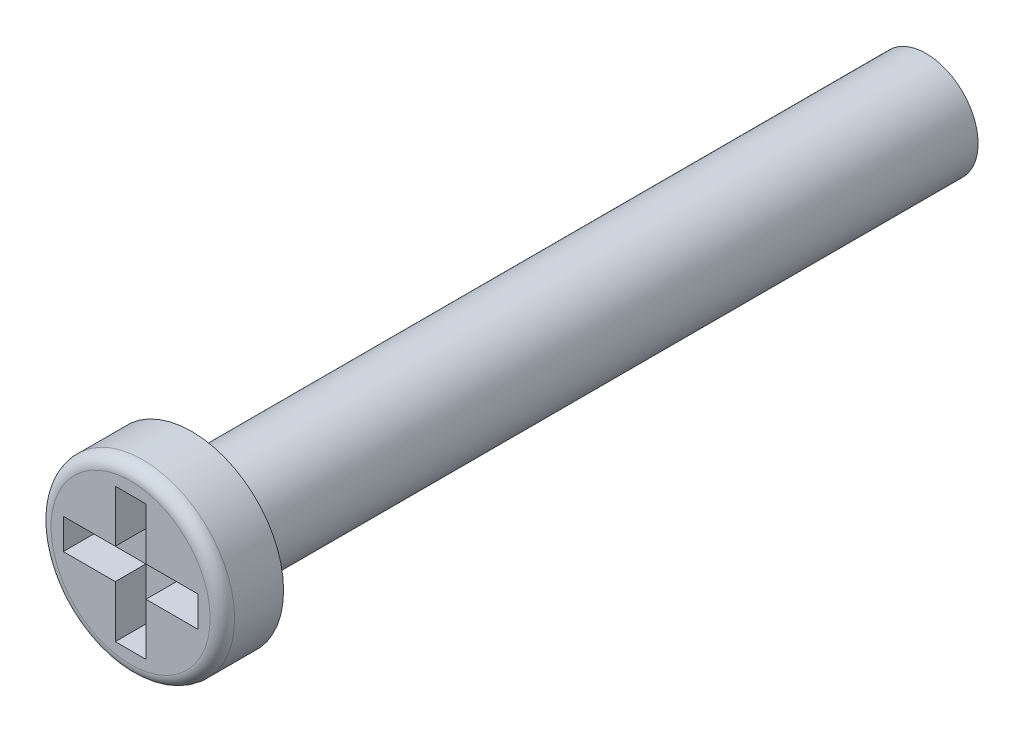
ISO-10303-21;
HEADER;
FILE_DESCRIPTION(('STEP AP214'),'2;1');
FILE_NAME('part.step','',(''),(''),'','','');
FILE_SCHEMA(('AUTOMOTIVE_DESIGN { 1 0 10303 214 1 1 1 1 }'));
ENDSEC;
DATA;
#1=APPLICATION_CONTEXT('core data for automotive mechanical design processes');
#2=APPLICATION_PROTOCOL_DEFINITION('international standard','automotive_design',2000,#1);
#3=PRODUCT_CONTEXT('',#1,'mechanical');
#4=PRODUCT('Part','Part','',(#3));
#5=PRODUCT_RELATED_PRODUCT_CATEGORY('part','',(#4));
#6=PRODUCT_DEFINITION_FORMATION('','',#4);
#7=PRODUCT_DEFINITION_CONTEXT('part definition',#1,'design');
#8=PRODUCT_DEFINITION('design','',#6,#7);
#9=PRODUCT_DEFINITION_SHAPE('','',#8);
#10=(LENGTH_UNIT() NAMED_UNIT(*) SI_UNIT(.MILLI.,.METRE.));
#11=(NAMED_UNIT(*) PLANE_ANGLE_UNIT() SI_UNIT($,.RADIAN.));
#12=(NAMED_UNIT(*) SI_UNIT($,.STERADIAN.) SOLID_ANGLE_UNIT());
#13=UNCERTAINTY_MEASURE_WITH_UNIT(LENGTH_MEASURE(1.E-05),#10,'distance_accuracy_value','');
#14=(GEOMETRIC_REPRESENTATION_CONTEXT(3) GLOBAL_UNCERTAINTY_ASSIGNED_CONTEXT((#13)) GLOBAL_UNIT_ASSIGNED_CONTEXT((#10,
#11,#12)) REPRESENTATION_CONTEXT('',''));
#15=CARTESIAN_POINT('',(0.,0.,0.));
#16=DIRECTION('',(0.,0.,1.));
#17=DIRECTION('',(1.,0.,0.));
#18=AXIS2_PLACEMENT_3D('',#15,#16,#17);
#19=CARTESIAN_POINT('',(0.,0.,1.));
#20=DIRECTION('',(0.,0.,-1.));
#21=DIRECTION('',(-1.,0.,0.));
#22=AXIS2_PLACEMENT_3D('',#19,#20,#21);
#23=CYLINDRICAL_SURFACE('',#22,1.5);
#24=CARTESIAN_POINT('',(0.,0.,0.8));
#25=DIRECTION('',(0.,0.,1.));
#26=DIRECTION('',(1.,0.,0.));
#27=AXIS2_PLACEMENT_3D('',#24,#25,#26);
#28=CIRCLE('',#27,1.5);
#29=CARTESIAN_POINT('',(1.5,0.,0.8));
#30=VERTEX_POINT('',#29);
#31=EDGE_CURVE('E11',#30,#30,#28,.F.);
#32=ORIENTED_EDGE('',*,*,#31,.T.);
#33=EDGE_LOOP('',(#32));
#34=FACE_BOUND('',#33,.T.);
#35=CARTESIAN_POINT('',(0.,0.,0.));
#36=DIRECTION('',(0.,0.,1.));
#37=DIRECTION('',(1.,0.,0.));
#38=AXIS2_PLACEMENT_3D('',#35,#36,#37);
#39=CIRCLE('',#38,1.5);
#40=CARTESIAN_POINT('',(1.5,0.,0.));
#41=VERTEX_POINT('',#40);
#42=EDGE_CURVE('E210',#41,#41,#39,.T.);
#43=ORIENTED_EDGE('',*,*,#42,.T.);
#44=EDGE_LOOP('',(#43));
#45=FACE_BOUND('',#44,.T.);
#46=ADVANCED_FACE('F34',(#34,#45),#23,.T.);
#47=CARTESIAN_POINT('',(0.,0.,1.));
#48=DIRECTION('',(0.,0.,1.));
#49=DIRECTION('',(1.,0.,0.));
#50=AXIS2_PLACEMENT_3D('',#47,#48,#49);
#51=PLANE('',#50);
#52=CARTESIAN_POINT('',(0.,0.,1.));
#53=DIRECTION('',(0.,0.,1.));
#54=DIRECTION('',(1.,0.,0.));
#55=AXIS2_PLACEMENT_3D('',#52,#53,#54);
#56=CIRCLE('',#55,1.3);
#57=CARTESIAN_POINT('',(1.3,0.,1.));
#58=VERTEX_POINT('',#57);
#59=EDGE_CURVE('E42',#58,#58,#56,.T.);
#60=ORIENTED_EDGE('',*,*,#59,.T.);
#61=EDGE_LOOP('',(#60));
#62=FACE_BOUND('',#61,.T.);
#63=DIRECTION('',(0.,1.,0.));
#64=VECTOR('',#63,1.);
#65=CARTESIAN_POINT('',(0.25,-1.1,1.));
#66=LINE('',#65,#64);
#67=CARTESIAN_POINT('',(0.25,-1.1,1.));
#68=VERTEX_POINT('',#67);
#69=CARTESIAN_POINT('',(0.25,-0.25,1.));
#70=VERTEX_POINT('',#69);
#71=EDGE_CURVE('E49',#68,#70,#66,.T.);
#72=ORIENTED_EDGE('',*,*,#71,.F.);
#73=DIRECTION('',(1.,0.,0.));
#74=VECTOR('',#73,1.);
#75=CARTESIAN_POINT('',(-0.25,-1.1,1.));
#76=LINE('',#75,#74);
#77=CARTESIAN_POINT('',(-0.25,-1.1,1.));
#78=VERTEX_POINT('',#77);
#79=EDGE_CURVE('E186',#78,#68,#76,.T.);
#80=ORIENTED_EDGE('',*,*,#79,.F.);
#81=DIRECTION('',(0.,-1.,0.));
#82=VECTOR('',#81,1.);
#83=CARTESIAN_POINT('',(-0.25,-1.1,1.));
#84=LINE('',#83,#82);
#85=CARTESIAN_POINT('',(-0.25,-0.25,1.));
#86=VERTEX_POINT('',#85);
#87=EDGE_CURVE('E184',#86,#78,#84,.T.);
#88=ORIENTED_EDGE('',*,*,#87,.F.);
#89=DIRECTION('',(1.,0.,0.));
#90=VECTOR('',#89,1.);
#91=CARTESIAN_POINT('',(-1.1,-0.25,1.));
#92=LINE('',#91,#90);
#93=CARTESIAN_POINT('',(-1.1,-0.25,1.));
#94=VERTEX_POINT('',#93);
#95=EDGE_CURVE('E133',#94,#86,#92,.T.);
#96=ORIENTED_EDGE('',*,*,#95,.F.);
#97=DIRECTION('',(0.,-1.,0.));
#98=VECTOR('',#97,1.);
#99=CARTESIAN_POINT('',(-1.1,0.25,1.));
#100=LINE('',#99,#98);
#101=CARTESIAN_POINT('',(-1.1,0.25,1.));
#102=VERTEX_POINT('',#101);
#103=EDGE_CURVE('E180',#102,#94,#100,.T.);
#104=ORIENTED_EDGE('',*,*,#103,.F.);
#105=DIRECTION('',(-1.,0.,0.));
#106=VECTOR('',#105,1.);
#107=CARTESIAN_POINT('',(-1.1,0.25,1.));
#108=LINE('',#107,#106);
#109=CARTESIAN_POINT('',(-0.25,0.25,1.));
#110=VERTEX_POINT('',#109);
#111=EDGE_CURVE('E177',#110,#102,#108,.T.);
#112=ORIENTED_EDGE('',*,*,#111,.F.);
#113=DIRECTION('',(0.,-1.,0.));
#114=VECTOR('',#113,1.);
#115=CARTESIAN_POINT('',(-0.25,1.1,1.));
#116=LINE('',#115,#114);
#117=CARTESIAN_POINT('',(-0.25,1.1,1.));
#118=VERTEX_POINT('',#117);
#119=EDGE_CURVE('E174',#118,#110,#116,.T.);
#120=ORIENTED_EDGE('',*,*,#119,.F.);
#121=DIRECTION('',(-1.,0.,0.));
#122=VECTOR('',#121,1.);
#123=CARTESIAN_POINT('',(-0.25,1.1,1.));
#124=LINE('',#123,#122);
#125=CARTESIAN_POINT('',(0.25,1.1,1.));
#126=VERTEX_POINT('',#125);
#127=EDGE_CURVE('E171',#126,#118,#124,.T.);
#128=ORIENTED_EDGE('',*,*,#127,.F.);
#129=DIRECTION('',(0.,1.,0.));
#130=VECTOR('',#129,1.);
#131=CARTESIAN_POINT('',(0.25,1.1,1.));
#132=LINE('',#131,#130);
#133=CARTESIAN_POINT('',(0.25,0.25,1.));
#134=VERTEX_POINT('',#133);
#135=EDGE_CURVE('E168',#134,#126,#132,.T.);
#136=ORIENTED_EDGE('',*,*,#135,.F.);
#137=DIRECTION('',(-1.,0.,0.));
#138=VECTOR('',#137,1.);
#139=CARTESIAN_POINT('',(0.25,0.25,1.));
#140=LINE('',#139,#138);
#141=CARTESIAN_POINT('',(1.1,0.25,1.));
#142=VERTEX_POINT('',#141);
#143=EDGE_CURVE('E165',#142,#134,#140,.T.);
#144=ORIENTED_EDGE('',*,*,#143,.F.);
#145=DIRECTION('',(0.,1.,0.));
#146=VECTOR('',#145,1.);
#147=CARTESIAN_POINT('',(1.1,0.25,1.));
#148=LINE('',#147,#146);
#149=CARTESIAN_POINT('',(1.1,-0.25,1.));
#150=VERTEX_POINT('',#149);
#151=EDGE_CURVE('E162',#150,#142,#148,.T.);
#152=ORIENTED_EDGE('',*,*,#151,.F.);
#153=DIRECTION('',(1.,0.,0.));
#154=VECTOR('',#153,1.);
#155=CARTESIAN_POINT('',(0.25,-0.25,1.));
#156=LINE('',#155,#154);
#157=EDGE_CURVE('E159',#70,#150,#156,.T.);
#158=ORIENTED_EDGE('',*,*,#157,.F.);
#159=EDGE_LOOP('',(#72,#80,#88,#96,#104,#112,#120,#128,#136,#144,#152,#158));
#160=FACE_BOUND('',#159,.T.);
#161=ADVANCED_FACE('F218',(#62,#160),#51,.T.);
#162=CARTESIAN_POINT('',(0.,0.,0.));
#163=DIRECTION('',(0.,0.,1.));
#164=DIRECTION('',(1.,0.,0.));
#165=AXIS2_PLACEMENT_3D('',#162,#163,#164);
#166=PLANE('',#165);
#167=CARTESIAN_POINT('',(0.,0.,0.));
#168=DIRECTION('',(0.,0.,-1.));
#169=DIRECTION('',(-1.,0.,0.));
#170=AXIS2_PLACEMENT_3D('',#167,#168,#169);
#171=CIRCLE('',#170,0.85);
#172=CARTESIAN_POINT('',(-0.85,0.,0.));
#173=VERTEX_POINT('',#172);
#174=EDGE_CURVE('E211',#173,#173,#171,.T.);
#175=ORIENTED_EDGE('',*,*,#174,.F.);
#176=EDGE_LOOP('',(#175));
#177=FACE_BOUND('',#176,.T.);
#178=ORIENTED_EDGE('',*,*,#42,.F.);
#179=EDGE_LOOP('',(#178));
#180=FACE_BOUND('',#179,.T.);
#181=ADVANCED_FACE('F234',(#177,#180),#166,.F.);
#182=CARTESIAN_POINT('',(0.,0.,-12.));
#183=DIRECTION('',(0.,0.,1.));
#184=DIRECTION('',(1.,0.,0.));
#185=AXIS2_PLACEMENT_3D('',#182,#183,#184);
#186=CYLINDRICAL_SURFACE('',#185,0.85);
#187=CARTESIAN_POINT('',(0.,0.,-12.));
#188=DIRECTION('',(0.,0.,-1.));
#189=DIRECTION('',(-1.,0.,0.));
#190=AXIS2_PLACEMENT_3D('',#187,#188,#189);
#191=CIRCLE('',#190,0.85);
#192=CARTESIAN_POINT('',(-0.85,0.,-12.));
#193=VERTEX_POINT('',#192);
#194=EDGE_CURVE('E190',#193,#193,#191,.T.);
#195=ORIENTED_EDGE('',*,*,#194,.F.);
#196=EDGE_LOOP('',(#195));
#197=FACE_BOUND('',#196,.T.);
#198=ORIENTED_EDGE('',*,*,#174,.T.);
#199=EDGE_LOOP('',(#198));
#200=FACE_BOUND('',#199,.T.);
#201=ADVANCED_FACE('F239',(#197,#200),#186,.T.);
#202=CARTESIAN_POINT('',(0.,0.,-12.));
#203=DIRECTION('',(0.,0.,-1.));
#204=DIRECTION('',(-1.,0.,0.));
#205=AXIS2_PLACEMENT_3D('',#202,#203,#204);
#206=PLANE('',#205);
#207=ORIENTED_EDGE('',*,*,#194,.T.);
#208=EDGE_LOOP('',(#207));
#209=FACE_BOUND('',#208,.T.);
#210=ADVANCED_FACE('F244',(#209),#206,.T.);
#211=CARTESIAN_POINT('',(0.25,-1.1,0.5));
#212=DIRECTION('',(1.,0.,0.));
#213=DIRECTION('',(0.,1.,0.));
#214=AXIS2_PLACEMENT_3D('',#211,#212,#213);
#215=PLANE('',#214);
#216=ORIENTED_EDGE('',*,*,#71,.T.);
#217=DIRECTION('',(0.,0.,1.));
#218=VECTOR('',#217,1.);
#219=CARTESIAN_POINT('',(0.25,-0.25,0.5));
#220=LINE('',#219,#218);
#221=CARTESIAN_POINT('',(0.25,-0.25,0.5));
#222=VERTEX_POINT('',#221);
#223=EDGE_CURVE('E97',#222,#70,#220,.T.);
#224=ORIENTED_EDGE('',*,*,#223,.F.);
#225=DIRECTION('',(0.,1.,0.));
#226=VECTOR('',#225,1.);
#227=CARTESIAN_POINT('',(0.25,-1.1,0.5));
#228=LINE('',#227,#226);
#229=CARTESIAN_POINT('',(0.25,-1.1,0.5));
#230=VERTEX_POINT('',#229);
#231=EDGE_CURVE('E188',#230,#222,#228,.T.);
#232=ORIENTED_EDGE('',*,*,#231,.F.);
#233=DIRECTION('',(0.,0.,1.));
#234=VECTOR('',#233,1.);
#235=CARTESIAN_POINT('',(0.25,-1.1,0.5));
#236=LINE('',#235,#234);
#237=EDGE_CURVE('E57',#230,#68,#236,.T.);
#238=ORIENTED_EDGE('',*,*,#237,.T.);
#239=EDGE_LOOP('',(#216,#224,#232,#238));
#240=FACE_BOUND('',#239,.T.);
#241=ADVANCED_FACE('F248',(#240),#215,.F.);
#242=CARTESIAN_POINT('',(-0.25,-1.1,0.5));
#243=DIRECTION('',(0.,-1.,0.));
#244=DIRECTION('',(0.,0.,-1.));
#245=AXIS2_PLACEMENT_3D('',#242,#243,#244);
#246=PLANE('',#245);
#247=ORIENTED_EDGE('',*,*,#79,.T.);
#248=ORIENTED_EDGE('',*,*,#237,.F.);
#249=DIRECTION('',(1.,0.,0.));
#250=VECTOR('',#249,1.);
#251=CARTESIAN_POINT('',(-0.25,-1.1,0.5));
#252=LINE('',#251,#250);
#253=CARTESIAN_POINT('',(-0.25,-1.1,0.5));
#254=VERTEX_POINT('',#253);
#255=EDGE_CURVE('E145',#254,#230,#252,.T.);
#256=ORIENTED_EDGE('',*,*,#255,.F.);
#257=DIRECTION('',(0.,0.,1.));
#258=VECTOR('',#257,1.);
#259=CARTESIAN_POINT('',(-0.25,-1.1,0.5));
#260=LINE('',#259,#258);
#261=EDGE_CURVE('E137',#254,#78,#260,.T.);
#262=ORIENTED_EDGE('',*,*,#261,.T.);
#263=EDGE_LOOP('',(#247,#248,#256,#262));
#264=FACE_BOUND('',#263,.T.);
#265=ADVANCED_FACE('F252',(#264),#246,.F.);
#266=CARTESIAN_POINT('',(-0.25,-1.1,0.5));
#267=DIRECTION('',(-1.,0.,0.));
#268=DIRECTION('',(0.,-1.,0.));
#269=AXIS2_PLACEMENT_3D('',#266,#267,#268);
#270=PLANE('',#269);
#271=ORIENTED_EDGE('',*,*,#87,.T.);
#272=ORIENTED_EDGE('',*,*,#261,.F.);
#273=DIRECTION('',(0.,-1.,0.));
#274=VECTOR('',#273,1.);
#275=CARTESIAN_POINT('',(-0.25,-1.1,0.5));
#276=LINE('',#275,#274);
#277=CARTESIAN_POINT('',(-0.25,-0.25,0.5));
#278=VERTEX_POINT('',#277);
#279=EDGE_CURVE('E141',#278,#254,#276,.T.);
#280=ORIENTED_EDGE('',*,*,#279,.F.);
#281=DIRECTION('',(0.,0.,1.));
#282=VECTOR('',#281,1.);
#283=CARTESIAN_POINT('',(-0.25,-0.25,0.5));
#284=LINE('',#283,#282);
#285=EDGE_CURVE('E126',#278,#86,#284,.T.);
#286=ORIENTED_EDGE('',*,*,#285,.T.);
#287=EDGE_LOOP('',(#271,#272,#280,#286));
#288=FACE_BOUND('',#287,.T.);
#289=ADVANCED_FACE('F142',(#288),#270,.F.);
#290=CARTESIAN_POINT('',(-1.1,-0.25,0.5));
#291=DIRECTION('',(0.,-1.,0.));
#292=DIRECTION('',(0.,0.,-1.));
#293=AXIS2_PLACEMENT_3D('',#290,#291,#292);
#294=PLANE('',#293);
#295=ORIENTED_EDGE('',*,*,#95,.T.);
#296=ORIENTED_EDGE('',*,*,#285,.F.);
#297=DIRECTION('',(1.,0.,0.));
#298=VECTOR('',#297,1.);
#299=CARTESIAN_POINT('',(-1.1,-0.25,0.5));
#300=LINE('',#299,#298);
#301=CARTESIAN_POINT('',(-1.1,-0.25,0.5));
#302=VERTEX_POINT('',#301);
#303=EDGE_CURVE('E130',#302,#278,#300,.T.);
#304=ORIENTED_EDGE('',*,*,#303,.F.);
#305=DIRECTION('',(0.,0.,1.));
#306=VECTOR('',#305,1.);
#307=CARTESIAN_POINT('',(-1.1,-0.25,0.5));
#308=LINE('',#307,#306);
#309=EDGE_CURVE('E138',#302,#94,#308,.T.);
#310=ORIENTED_EDGE('',*,*,#309,.T.);
#311=EDGE_LOOP('',(#295,#296,#304,#310));
#312=FACE_BOUND('',#311,.T.);
#313=ADVANCED_FACE('F128',(#312),#294,.F.);
#314=CARTESIAN_POINT('',(-1.1,0.25,0.5));
#315=DIRECTION('',(-1.,0.,0.));
#316=DIRECTION('',(0.,0.,1.));
#317=AXIS2_PLACEMENT_3D('',#314,#315,#316);
#318=PLANE('',#317);
#319=ORIENTED_EDGE('',*,*,#103,.T.);
#320=ORIENTED_EDGE('',*,*,#309,.F.);
#321=DIRECTION('',(0.,-1.,0.));
#322=VECTOR('',#321,1.);
#323=CARTESIAN_POINT('',(-1.1,0.25,0.5));
#324=LINE('',#323,#322);
#325=CARTESIAN_POINT('',(-1.1,0.25,0.5));
#326=VERTEX_POINT('',#325);
#327=EDGE_CURVE('E151',#326,#302,#324,.T.);
#328=ORIENTED_EDGE('',*,*,#327,.F.);
#329=DIRECTION('',(0.,0.,1.));
#330=VECTOR('',#329,1.);
#331=CARTESIAN_POINT('',(-1.1,0.25,0.5));
#332=LINE('',#331,#330);
#333=EDGE_CURVE('E193',#326,#102,#332,.T.);
#334=ORIENTED_EDGE('',*,*,#333,.T.);
#335=EDGE_LOOP('',(#319,#320,#328,#334));
#336=FACE_BOUND('',#335,.T.);
#337=ADVANCED_FACE('F279',(#336),#318,.F.);
#338=CARTESIAN_POINT('',(-1.1,0.25,0.5));
#339=DIRECTION('',(0.,1.,0.));
#340=DIRECTION('',(0.,0.,1.));
#341=AXIS2_PLACEMENT_3D('',#338,#339,#340);
#342=PLANE('',#341);
#343=ORIENTED_EDGE('',*,*,#111,.T.);
#344=ORIENTED_EDGE('',*,*,#333,.F.);
#345=DIRECTION('',(-1.,0.,0.));
#346=VECTOR('',#345,1.);
#347=CARTESIAN_POINT('',(-1.1,0.25,0.5));
#348=LINE('',#347,#346);
#349=CARTESIAN_POINT('',(-0.25,0.25,0.5));
#350=VERTEX_POINT('',#349);
#351=EDGE_CURVE('E153',#350,#326,#348,.T.);
#352=ORIENTED_EDGE('',*,*,#351,.F.);
#353=DIRECTION('',(0.,0.,1.));
#354=VECTOR('',#353,1.);
#355=CARTESIAN_POINT('',(-0.25,0.25,0.5));
#356=LINE('',#355,#354);
#357=EDGE_CURVE('E195',#350,#110,#356,.T.);
#358=ORIENTED_EDGE('',*,*,#357,.T.);
#359=EDGE_LOOP('',(#343,#344,#352,#358));
#360=FACE_BOUND('',#359,.T.);
#361=ADVANCED_FACE('F275',(#360),#342,.F.);
#362=CARTESIAN_POINT('',(-0.25,1.1,0.5));
#363=DIRECTION('',(-1.,0.,0.));
#364=DIRECTION('',(0.,-1.,0.));
#365=AXIS2_PLACEMENT_3D('',#362,#363,#364);
#366=PLANE('',#365);
#367=ORIENTED_EDGE('',*,*,#119,.T.);
#368=ORIENTED_EDGE('',*,*,#357,.F.);
#369=DIRECTION('',(0.,-1.,0.));
#370=VECTOR('',#369,1.);
#371=CARTESIAN_POINT('',(-0.25,1.1,0.5));
#372=LINE('',#371,#370);
#373=CARTESIAN_POINT('',(-0.25,1.1,0.5));
#374=VERTEX_POINT('',#373);
#375=EDGE_CURVE('E313',#374,#350,#372,.T.);
#376=ORIENTED_EDGE('',*,*,#375,.F.);
#377=DIRECTION('',(0.,0.,1.));
#378=VECTOR('',#377,1.);
#379=CARTESIAN_POINT('',(-0.25,1.1,0.5));
#380=LINE('',#379,#378);
#381=EDGE_CURVE('E197',#374,#118,#380,.T.);
#382=ORIENTED_EDGE('',*,*,#381,.T.);
#383=EDGE_LOOP('',(#367,#368,#376,#382));
#384=FACE_BOUND('',#383,.T.);
#385=ADVANCED_FACE('F271',(#384),#366,.F.);
#386=CARTESIAN_POINT('',(-0.25,1.1,0.5));
#387=DIRECTION('',(0.,1.,0.));
#388=DIRECTION('',(0.,0.,1.));
#389=AXIS2_PLACEMENT_3D('',#386,#387,#388);
#390=PLANE('',#389);
#391=ORIENTED_EDGE('',*,*,#127,.T.);
#392=ORIENTED_EDGE('',*,*,#381,.F.);
#393=DIRECTION('',(-1.,0.,0.));
#394=VECTOR('',#393,1.);
#395=CARTESIAN_POINT('',(-0.25,1.1,0.5));
#396=LINE('',#395,#394);
#397=CARTESIAN_POINT('',(0.25,1.1,0.5));
#398=VERTEX_POINT('',#397);
#399=EDGE_CURVE('E310',#398,#374,#396,.T.);
#400=ORIENTED_EDGE('',*,*,#399,.F.);
#401=DIRECTION('',(0.,0.,1.));
#402=VECTOR('',#401,1.);
#403=CARTESIAN_POINT('',(0.25,1.1,0.5));
#404=LINE('',#403,#402);
#405=EDGE_CURVE('E199',#398,#126,#404,.T.);
#406=ORIENTED_EDGE('',*,*,#405,.T.);
#407=EDGE_LOOP('',(#391,#392,#400,#406));
#408=FACE_BOUND('',#407,.T.);
#409=ADVANCED_FACE('F267',(#408),#390,.F.);
#410=CARTESIAN_POINT('',(0.25,1.1,0.5));
#411=DIRECTION('',(1.,0.,0.));
#412=DIRECTION('',(0.,1.,0.));
#413=AXIS2_PLACEMENT_3D('',#410,#411,#412);
#414=PLANE('',#413);
#415=ORIENTED_EDGE('',*,*,#135,.T.);
#416=ORIENTED_EDGE('',*,*,#405,.F.);
#417=DIRECTION('',(0.,1.,0.));
#418=VECTOR('',#417,1.);
#419=CARTESIAN_POINT('',(0.25,1.1,0.5));
#420=LINE('',#419,#418);
#421=CARTESIAN_POINT('',(0.25,0.25,0.5));
#422=VERTEX_POINT('',#421);
#423=EDGE_CURVE('E307',#422,#398,#420,.T.);
#424=ORIENTED_EDGE('',*,*,#423,.F.);
#425=DIRECTION('',(0.,0.,1.));
#426=VECTOR('',#425,1.);
#427=CARTESIAN_POINT('',(0.25,0.25,0.5));
#428=LINE('',#427,#426);
#429=EDGE_CURVE('E201',#422,#134,#428,.T.);
#430=ORIENTED_EDGE('',*,*,#429,.T.);
#431=EDGE_LOOP('',(#415,#416,#424,#430));
#432=FACE_BOUND('',#431,.T.);
#433=ADVANCED_FACE('F263',(#432),#414,.F.);
#434=CARTESIAN_POINT('',(0.25,0.25,0.5));
#435=DIRECTION('',(0.,1.,0.));
#436=DIRECTION('',(0.,0.,1.));
#437=AXIS2_PLACEMENT_3D('',#434,#435,#436);
#438=PLANE('',#437);
#439=ORIENTED_EDGE('',*,*,#143,.T.);
#440=ORIENTED_EDGE('',*,*,#429,.F.);
#441=DIRECTION('',(-1.,0.,0.));
#442=VECTOR('',#441,1.);
#443=CARTESIAN_POINT('',(0.25,0.25,0.5));
#444=LINE('',#443,#442);
#445=CARTESIAN_POINT('',(1.1,0.25,0.5));
#446=VERTEX_POINT('',#445);
#447=EDGE_CURVE('E304',#446,#422,#444,.T.);
#448=ORIENTED_EDGE('',*,*,#447,.F.);
#449=DIRECTION('',(0.,0.,1.));
#450=VECTOR('',#449,1.);
#451=CARTESIAN_POINT('',(1.1,0.25,0.5));
#452=LINE('',#451,#450);
#453=EDGE_CURVE('E203',#446,#142,#452,.T.);
#454=ORIENTED_EDGE('',*,*,#453,.T.);
#455=EDGE_LOOP('',(#439,#440,#448,#454));
#456=FACE_BOUND('',#455,.T.);
#457=ADVANCED_FACE('F259',(#456),#438,.F.);
#458=CARTESIAN_POINT('',(1.1,0.25,0.5));
#459=DIRECTION('',(1.,0.,0.));
#460=DIRECTION('',(0.,0.,-1.));
#461=AXIS2_PLACEMENT_3D('',#458,#459,#460);
#462=PLANE('',#461);
#463=ORIENTED_EDGE('',*,*,#151,.T.);
#464=ORIENTED_EDGE('',*,*,#453,.F.);
#465=DIRECTION('',(0.,1.,0.));
#466=VECTOR('',#465,1.);
#467=CARTESIAN_POINT('',(1.1,0.25,0.5));
#468=LINE('',#467,#466);
#469=CARTESIAN_POINT('',(1.1,-0.25,0.5));
#470=VERTEX_POINT('',#469);
#471=EDGE_CURVE('E299',#470,#446,#468,.T.);
#472=ORIENTED_EDGE('',*,*,#471,.F.);
#473=DIRECTION('',(0.,0.,1.));
#474=VECTOR('',#473,1.);
#475=CARTESIAN_POINT('',(1.1,-0.25,0.5));
#476=LINE('',#475,#474);
#477=EDGE_CURVE('E205',#470,#150,#476,.T.);
#478=ORIENTED_EDGE('',*,*,#477,.T.);
#479=EDGE_LOOP('',(#463,#464,#472,#478));
#480=FACE_BOUND('',#479,.T.);
#481=ADVANCED_FACE('F255',(#480),#462,.F.);
#482=CARTESIAN_POINT('',(0.25,-0.25,0.5));
#483=DIRECTION('',(0.,-1.,0.));
#484=DIRECTION('',(0.,0.,-1.));
#485=AXIS2_PLACEMENT_3D('',#482,#483,#484);
#486=PLANE('',#485);
#487=ORIENTED_EDGE('',*,*,#157,.T.);
#488=ORIENTED_EDGE('',*,*,#477,.F.);
#489=DIRECTION('',(1.,0.,0.));
#490=VECTOR('',#489,1.);
#491=CARTESIAN_POINT('',(0.25,-0.25,0.5));
#492=LINE('',#491,#490);
#493=EDGE_CURVE('E297',#222,#470,#492,.T.);
#494=ORIENTED_EDGE('',*,*,#493,.F.);
#495=ORIENTED_EDGE('',*,*,#223,.T.);
#496=EDGE_LOOP('',(#487,#488,#494,#495));
#497=FACE_BOUND('',#496,.T.);
#498=ADVANCED_FACE('F226',(#497),#486,.F.);
#499=CARTESIAN_POINT('',(0.,0.,0.5));
#500=DIRECTION('',(0.,0.,-1.));
#501=DIRECTION('',(-1.,0.,0.));
#502=AXIS2_PLACEMENT_3D('',#499,#500,#501);
#503=PLANE('',#502);
#504=ORIENTED_EDGE('',*,*,#231,.T.);
#505=ORIENTED_EDGE('',*,*,#493,.T.);
#506=ORIENTED_EDGE('',*,*,#471,.T.);
#507=ORIENTED_EDGE('',*,*,#447,.T.);
#508=ORIENTED_EDGE('',*,*,#423,.T.);
#509=ORIENTED_EDGE('',*,*,#399,.T.);
#510=ORIENTED_EDGE('',*,*,#375,.T.);
#511=ORIENTED_EDGE('',*,*,#351,.T.);
#512=ORIENTED_EDGE('',*,*,#327,.T.);
#513=ORIENTED_EDGE('',*,*,#303,.T.);
#514=ORIENTED_EDGE('',*,*,#279,.T.);
#515=ORIENTED_EDGE('',*,*,#255,.T.);
#516=EDGE_LOOP('',(#504,#505,#506,#507,#508,#509,#510,#511,#512,#513,#514,#515));
#517=FACE_BOUND('',#516,.T.);
#518=ADVANCED_FACE('F148',(#517),#503,.F.);
#519=CARTESIAN_POINT('',(0.,0.,0.8));
#520=DIRECTION('',(0.,0.,1.));
#521=DIRECTION('',(1.,0.,0.));
#522=AXIS2_PLACEMENT_3D('',#519,#520,#521);
#523=TOROIDAL_SURFACE('',#522,1.3,0.2);
#524=ORIENTED_EDGE('',*,*,#31,.F.);
#525=EDGE_LOOP('',(#524));
#526=FACE_BOUND('',#525,.T.);
#527=ORIENTED_EDGE('',*,*,#59,.F.);
#528=EDGE_LOOP('',(#527));
#529=FACE_BOUND('',#528,.T.);
#530=ADVANCED_FACE('F36',(#526,#529),#523,.T.);
#531=CLOSED_SHELL('',(#46,#161,#181,#201,#210,#241,#265,#289,#313,#337,#361,#385,#409,#433,#457,
#481,#498,#518,#530));
#532=MANIFOLD_SOLID_BREP('B2',#531);
#533=ADVANCED_BREP_SHAPE_REPRESENTATION('',(#18,#532),#14);
#534=SHAPE_DEFINITION_REPRESENTATION(#9,#533);
ENDSEC;
END-ISO-10303-21;
